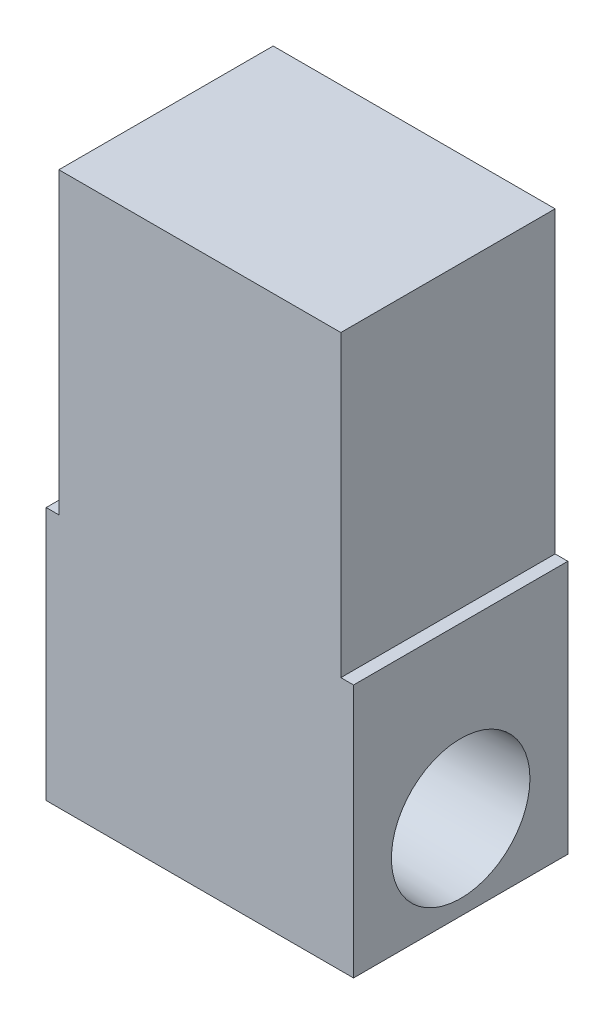
ISO-10303-21;
HEADER;
FILE_DESCRIPTION(('STEP AP214'),'2;1');
FILE_NAME('part.step','',(''),(''),'','','');
FILE_SCHEMA(('AUTOMOTIVE_DESIGN { 1 0 10303 214 1 1 1 1 }'));
ENDSEC;
DATA;
#1=APPLICATION_CONTEXT('core data for automotive mechanical design processes');
#2=APPLICATION_PROTOCOL_DEFINITION('international standard','automotive_design',2000,#1);
#3=PRODUCT_CONTEXT('',#1,'mechanical');
#4=PRODUCT('Part','Part','',(#3));
#5=PRODUCT_RELATED_PRODUCT_CATEGORY('part','',(#4));
#6=PRODUCT_DEFINITION_FORMATION('','',#4);
#7=PRODUCT_DEFINITION_CONTEXT('part definition',#1,'design');
#8=PRODUCT_DEFINITION('design','',#6,#7);
#9=PRODUCT_DEFINITION_SHAPE('','',#8);
#10=(LENGTH_UNIT() NAMED_UNIT(*) SI_UNIT(.MILLI.,.METRE.));
#11=(NAMED_UNIT(*) PLANE_ANGLE_UNIT() SI_UNIT($,.RADIAN.));
#12=(NAMED_UNIT(*) SI_UNIT($,.STERADIAN.) SOLID_ANGLE_UNIT());
#13=UNCERTAINTY_MEASURE_WITH_UNIT(LENGTH_MEASURE(1.E-05),#10,'distance_accuracy_value','');
#14=(GEOMETRIC_REPRESENTATION_CONTEXT(3) GLOBAL_UNCERTAINTY_ASSIGNED_CONTEXT((#13)) GLOBAL_UNIT_ASSIGNED_CONTEXT((#10,
#11,#12)) REPRESENTATION_CONTEXT('',''));
#15=CARTESIAN_POINT('',(0.,0.,0.));
#16=DIRECTION('',(0.,0.,1.));
#17=DIRECTION('',(1.,0.,0.));
#18=AXIS2_PLACEMENT_3D('',#15,#16,#17);
#19=CARTESIAN_POINT('',(0.,-11.43,19.304));
#20=DIRECTION('',(0.,1.,0.));
#21=DIRECTION('',(0.,0.,1.));
#22=AXIS2_PLACEMENT_3D('',#19,#20,#21);
#23=PLANE('',#22);
#24=DIRECTION('',(1.,0.,0.));
#25=VECTOR('',#24,1.);
#26=CARTESIAN_POINT('',(0.,-11.43,0.));
#27=LINE('',#26,#25);
#28=CARTESIAN_POINT('',(-13.843,-11.43,0.));
#29=VERTEX_POINT('',#28);
#30=CARTESIAN_POINT('',(13.843,-11.43,0.));
#31=VERTEX_POINT('',#30);
#32=EDGE_CURVE('E164',#29,#31,#27,.T.);
#33=ORIENTED_EDGE('',*,*,#32,.T.);
#34=DIRECTION('',(0.,0.,-1.));
#35=VECTOR('',#34,1.);
#36=CARTESIAN_POINT('',(13.843,-11.43,19.304));
#37=LINE('',#36,#35);
#38=CARTESIAN_POINT('',(13.843,-11.43,19.304));
#39=VERTEX_POINT('',#38);
#40=EDGE_CURVE('E11',#39,#31,#37,.T.);
#41=ORIENTED_EDGE('',*,*,#40,.F.);
#42=DIRECTION('',(1.,0.,0.));
#43=VECTOR('',#42,1.);
#44=CARTESIAN_POINT('',(0.,-11.43,19.304));
#45=LINE('',#44,#43);
#46=CARTESIAN_POINT('',(-13.843,-11.43,19.304));
#47=VERTEX_POINT('',#46);
#48=EDGE_CURVE('E155',#47,#39,#45,.T.);
#49=ORIENTED_EDGE('',*,*,#48,.F.);
#50=DIRECTION('',(0.,0.,-1.));
#51=VECTOR('',#50,1.);
#52=CARTESIAN_POINT('',(-13.843,-11.43,19.304));
#53=LINE('',#52,#51);
#54=EDGE_CURVE('E60',#47,#29,#53,.T.);
#55=ORIENTED_EDGE('',*,*,#54,.T.);
#56=EDGE_LOOP('',(#33,#41,#49,#55));
#57=FACE_BOUND('',#56,.T.);
#58=ADVANCED_FACE('F43',(#57),#23,.F.);
#59=CARTESIAN_POINT('',(13.843,0.,19.304));
#60=DIRECTION('',(-1.,0.,0.));
#61=DIRECTION('',(0.,0.,1.));
#62=AXIS2_PLACEMENT_3D('',#59,#60,#61);
#63=PLANE('',#62);
#64=CARTESIAN_POINT('',(13.843,-3.81,9.652));
#65=DIRECTION('',(1.,0.,0.));
#66=DIRECTION('',(0.,0.,-1.));
#67=AXIS2_PLACEMENT_3D('',#64,#65,#66);
#68=CIRCLE('',#67,6.2402847);
#69=CARTESIAN_POINT('',(13.843,-3.81,3.4117153));
#70=VERTEX_POINT('',#69);
#71=EDGE_CURVE('E173',#70,#70,#68,.T.);
#72=ORIENTED_EDGE('',*,*,#71,.F.);
#73=EDGE_LOOP('',(#72));
#74=FACE_BOUND('',#73,.T.);
#75=DIRECTION('',(0.,1.,0.));
#76=VECTOR('',#75,1.);
#77=CARTESIAN_POINT('',(13.843,0.,0.));
#78=LINE('',#77,#76);
#79=CARTESIAN_POINT('',(13.843,11.43,0.));
#80=VERTEX_POINT('',#79);
#81=EDGE_CURVE('E226',#31,#80,#78,.T.);
#82=ORIENTED_EDGE('',*,*,#81,.T.);
#83=DIRECTION('',(0.,0.,-1.));
#84=VECTOR('',#83,1.);
#85=CARTESIAN_POINT('',(13.843,11.43,19.304));
#86=LINE('',#85,#84);
#87=CARTESIAN_POINT('',(13.843,11.43,19.304));
#88=VERTEX_POINT('',#87);
#89=EDGE_CURVE('E52',#88,#80,#86,.T.);
#90=ORIENTED_EDGE('',*,*,#89,.F.);
#91=DIRECTION('',(0.,1.,0.));
#92=VECTOR('',#91,1.);
#93=CARTESIAN_POINT('',(13.843,0.,19.304));
#94=LINE('',#93,#92);
#95=EDGE_CURVE('E99',#39,#88,#94,.T.);
#96=ORIENTED_EDGE('',*,*,#95,.F.);
#97=ORIENTED_EDGE('',*,*,#40,.T.);
#98=EDGE_LOOP('',(#82,#90,#96,#97));
#99=FACE_BOUND('',#98,.T.);
#100=ADVANCED_FACE('F227',(#74,#99),#63,.F.);
#101=CARTESIAN_POINT('',(0.,11.43,19.304));
#102=DIRECTION('',(0.,1.,0.));
#103=DIRECTION('',(0.,0.,1.));
#104=AXIS2_PLACEMENT_3D('',#101,#102,#103);
#105=PLANE('',#104);
#106=DIRECTION('',(1.,0.,0.));
#107=VECTOR('',#106,1.);
#108=CARTESIAN_POINT('',(0.,11.43,0.));
#109=LINE('',#108,#107);
#110=CARTESIAN_POINT('',(12.7,11.43,0.));
#111=VERTEX_POINT('',#110);
#112=EDGE_CURVE('E206',#111,#80,#109,.T.);
#113=ORIENTED_EDGE('',*,*,#112,.F.);
#114=DIRECTION('',(0.,0.,-1.));
#115=VECTOR('',#114,1.);
#116=CARTESIAN_POINT('',(12.7,11.43,19.304));
#117=LINE('',#116,#115);
#118=CARTESIAN_POINT('',(12.7,11.43,19.304));
#119=VERTEX_POINT('',#118);
#120=EDGE_CURVE('E219',#119,#111,#117,.T.);
#121=ORIENTED_EDGE('',*,*,#120,.F.);
#122=DIRECTION('',(1.,0.,0.));
#123=VECTOR('',#122,1.);
#124=CARTESIAN_POINT('',(0.,11.43,19.304));
#125=LINE('',#124,#123);
#126=EDGE_CURVE('E143',#119,#88,#125,.T.);
#127=ORIENTED_EDGE('',*,*,#126,.T.);
#128=ORIENTED_EDGE('',*,*,#89,.T.);
#129=EDGE_LOOP('',(#113,#121,#127,#128));
#130=FACE_BOUND('',#129,.T.);
#131=ADVANCED_FACE('F224',(#130),#105,.T.);
#132=CARTESIAN_POINT('',(12.7,0.,19.304));
#133=DIRECTION('',(-1.,0.,0.));
#134=DIRECTION('',(0.,0.,1.));
#135=AXIS2_PLACEMENT_3D('',#132,#133,#134);
#136=PLANE('',#135);
#137=DIRECTION('',(0.,1.,0.));
#138=VECTOR('',#137,1.);
#139=CARTESIAN_POINT('',(12.7,0.,0.));
#140=LINE('',#139,#138);
#141=CARTESIAN_POINT('',(12.7,38.354,0.));
#142=VERTEX_POINT('',#141);
#143=EDGE_CURVE('E235',#111,#142,#140,.T.);
#144=ORIENTED_EDGE('',*,*,#143,.T.);
#145=DIRECTION('',(0.,0.,-1.));
#146=VECTOR('',#145,1.);
#147=CARTESIAN_POINT('',(12.7,38.354,19.304));
#148=LINE('',#147,#146);
#149=CARTESIAN_POINT('',(12.7,38.354,19.304));
#150=VERTEX_POINT('',#149);
#151=EDGE_CURVE('E216',#150,#142,#148,.T.);
#152=ORIENTED_EDGE('',*,*,#151,.F.);
#153=DIRECTION('',(0.,1.,0.));
#154=VECTOR('',#153,1.);
#155=CARTESIAN_POINT('',(12.7,0.,19.304));
#156=LINE('',#155,#154);
#157=EDGE_CURVE('E150',#119,#150,#156,.T.);
#158=ORIENTED_EDGE('',*,*,#157,.F.);
#159=ORIENTED_EDGE('',*,*,#120,.T.);
#160=EDGE_LOOP('',(#144,#152,#158,#159));
#161=FACE_BOUND('',#160,.T.);
#162=ADVANCED_FACE('F249',(#161),#136,.F.);
#163=CARTESIAN_POINT('',(0.,38.354,19.304));
#164=DIRECTION('',(0.,1.,0.));
#165=DIRECTION('',(0.,0.,1.));
#166=AXIS2_PLACEMENT_3D('',#163,#164,#165);
#167=PLANE('',#166);
#168=DIRECTION('',(1.,0.,0.));
#169=VECTOR('',#168,1.);
#170=CARTESIAN_POINT('',(0.,38.354,0.));
#171=LINE('',#170,#169);
#172=CARTESIAN_POINT('',(-12.7,38.354,0.));
#173=VERTEX_POINT('',#172);
#174=EDGE_CURVE('E238',#173,#142,#171,.T.);
#175=ORIENTED_EDGE('',*,*,#174,.F.);
#176=DIRECTION('',(0.,0.,-1.));
#177=VECTOR('',#176,1.);
#178=CARTESIAN_POINT('',(-12.7,38.354,19.304));
#179=LINE('',#178,#177);
#180=CARTESIAN_POINT('',(-12.7,38.354,19.304));
#181=VERTEX_POINT('',#180);
#182=EDGE_CURVE('E127',#181,#173,#179,.T.);
#183=ORIENTED_EDGE('',*,*,#182,.F.);
#184=DIRECTION('',(1.,0.,0.));
#185=VECTOR('',#184,1.);
#186=CARTESIAN_POINT('',(0.,38.354,19.304));
#187=LINE('',#186,#185);
#188=EDGE_CURVE('E136',#181,#150,#187,.T.);
#189=ORIENTED_EDGE('',*,*,#188,.T.);
#190=ORIENTED_EDGE('',*,*,#151,.T.);
#191=EDGE_LOOP('',(#175,#183,#189,#190));
#192=FACE_BOUND('',#191,.T.);
#193=ADVANCED_FACE('F245',(#192),#167,.T.);
#194=CARTESIAN_POINT('',(-12.7,0.,19.304));
#195=DIRECTION('',(-1.,0.,0.));
#196=DIRECTION('',(0.,0.,1.));
#197=AXIS2_PLACEMENT_3D('',#194,#195,#196);
#198=PLANE('',#197);
#199=DIRECTION('',(0.,1.,0.));
#200=VECTOR('',#199,1.);
#201=CARTESIAN_POINT('',(-12.7,0.,0.));
#202=LINE('',#201,#200);
#203=CARTESIAN_POINT('',(-12.7,11.43,0.));
#204=VERTEX_POINT('',#203);
#205=EDGE_CURVE('E122',#204,#173,#202,.T.);
#206=ORIENTED_EDGE('',*,*,#205,.F.);
#207=DIRECTION('',(0.,0.,-1.));
#208=VECTOR('',#207,1.);
#209=CARTESIAN_POINT('',(-12.7,11.43,19.304));
#210=LINE('',#209,#208);
#211=CARTESIAN_POINT('',(-12.7,11.43,19.304));
#212=VERTEX_POINT('',#211);
#213=EDGE_CURVE('E117',#212,#204,#210,.T.);
#214=ORIENTED_EDGE('',*,*,#213,.F.);
#215=DIRECTION('',(0.,1.,0.));
#216=VECTOR('',#215,1.);
#217=CARTESIAN_POINT('',(-12.7,0.,19.304));
#218=LINE('',#217,#216);
#219=EDGE_CURVE('E120',#212,#181,#218,.T.);
#220=ORIENTED_EDGE('',*,*,#219,.T.);
#221=ORIENTED_EDGE('',*,*,#182,.T.);
#222=EDGE_LOOP('',(#206,#214,#220,#221));
#223=FACE_BOUND('',#222,.T.);
#224=ADVANCED_FACE('F119',(#223),#198,.T.);
#225=CARTESIAN_POINT('',(-13.843,11.43,0.));
#226=VERTEX_POINT('',#225);
#227=EDGE_CURVE('E202',#226,#204,#109,.T.);
#228=ORIENTED_EDGE('',*,*,#227,.F.);
#229=DIRECTION('',(0.,0.,-1.));
#230=VECTOR('',#229,1.);
#231=CARTESIAN_POINT('',(-13.843,11.43,19.304));
#232=LINE('',#231,#230);
#233=CARTESIAN_POINT('',(-13.843,11.43,19.304));
#234=VERTEX_POINT('',#233);
#235=EDGE_CURVE('E87',#234,#226,#232,.T.);
#236=ORIENTED_EDGE('',*,*,#235,.F.);
#237=EDGE_CURVE('E134',#234,#212,#125,.T.);
#238=ORIENTED_EDGE('',*,*,#237,.T.);
#239=ORIENTED_EDGE('',*,*,#213,.T.);
#240=EDGE_LOOP('',(#228,#236,#238,#239));
#241=FACE_BOUND('',#240,.T.);
#242=ADVANCED_FACE('F139',(#241),#105,.T.);
#243=CARTESIAN_POINT('',(-13.843,0.,19.304));
#244=DIRECTION('',(-1.,0.,0.));
#245=DIRECTION('',(0.,0.,1.));
#246=AXIS2_PLACEMENT_3D('',#243,#244,#245);
#247=PLANE('',#246);
#248=CARTESIAN_POINT('',(-13.843,-3.81,9.652));
#249=DIRECTION('',(-1.,0.,0.));
#250=DIRECTION('',(0.,0.,1.));
#251=AXIS2_PLACEMENT_3D('',#248,#249,#250);
#252=CIRCLE('',#251,6.2402847);
#253=CARTESIAN_POINT('',(-13.843,-3.81,15.8922847));
#254=VERTEX_POINT('',#253);
#255=EDGE_CURVE('E189',#254,#254,#252,.T.);
#256=ORIENTED_EDGE('',*,*,#255,.F.);
#257=EDGE_LOOP('',(#256));
#258=FACE_BOUND('',#257,.T.);
#259=DIRECTION('',(0.,1.,0.));
#260=VECTOR('',#259,1.);
#261=CARTESIAN_POINT('',(-13.843,0.,0.));
#262=LINE('',#261,#260);
#263=EDGE_CURVE('E157',#29,#226,#262,.T.);
#264=ORIENTED_EDGE('',*,*,#263,.F.);
#265=ORIENTED_EDGE('',*,*,#54,.F.);
#266=DIRECTION('',(0.,1.,0.));
#267=VECTOR('',#266,1.);
#268=CARTESIAN_POINT('',(-13.843,0.,19.304));
#269=LINE('',#268,#267);
#270=EDGE_CURVE('E141',#47,#234,#269,.T.);
#271=ORIENTED_EDGE('',*,*,#270,.T.);
#272=ORIENTED_EDGE('',*,*,#235,.T.);
#273=EDGE_LOOP('',(#264,#265,#271,#272));
#274=FACE_BOUND('',#273,.T.);
#275=ADVANCED_FACE('F196',(#258,#274),#247,.T.);
#276=CARTESIAN_POINT('',(0.,0.,19.304));
#277=DIRECTION('',(0.,0.,1.));
#278=DIRECTION('',(1.,0.,0.));
#279=AXIS2_PLACEMENT_3D('',#276,#277,#278);
#280=PLANE('',#279);
#281=ORIENTED_EDGE('',*,*,#48,.T.);
#282=ORIENTED_EDGE('',*,*,#95,.T.);
#283=ORIENTED_EDGE('',*,*,#126,.F.);
#284=ORIENTED_EDGE('',*,*,#157,.T.);
#285=ORIENTED_EDGE('',*,*,#188,.F.);
#286=ORIENTED_EDGE('',*,*,#219,.F.);
#287=ORIENTED_EDGE('',*,*,#237,.F.);
#288=ORIENTED_EDGE('',*,*,#270,.F.);
#289=EDGE_LOOP('',(#281,#282,#283,#284,#285,#286,#287,#288));
#290=FACE_BOUND('',#289,.T.);
#291=ADVANCED_FACE('F132',(#290),#280,.T.);
#292=CARTESIAN_POINT('',(0.,0.,0.));
#293=DIRECTION('',(0.,0.,1.));
#294=DIRECTION('',(1.,0.,0.));
#295=AXIS2_PLACEMENT_3D('',#292,#293,#294);
#296=PLANE('',#295);
#297=ORIENTED_EDGE('',*,*,#32,.F.);
#298=ORIENTED_EDGE('',*,*,#263,.T.);
#299=ORIENTED_EDGE('',*,*,#227,.T.);
#300=ORIENTED_EDGE('',*,*,#205,.T.);
#301=ORIENTED_EDGE('',*,*,#174,.T.);
#302=ORIENTED_EDGE('',*,*,#143,.F.);
#303=ORIENTED_EDGE('',*,*,#112,.T.);
#304=ORIENTED_EDGE('',*,*,#81,.F.);
#305=EDGE_LOOP('',(#297,#298,#299,#300,#301,#302,#303,#304));
#306=FACE_BOUND('',#305,.T.);
#307=ADVANCED_FACE('F232',(#306),#296,.F.);
#308=CARTESIAN_POINT('',(3.68300000000001,-3.81,9.652));
#309=DIRECTION('',(1.,0.,0.));
#310=DIRECTION('',(0.,0.,-1.));
#311=AXIS2_PLACEMENT_3D('',#308,#309,#310);
#312=CONICAL_SURFACE('',#311,5.5626,1.02974425867665);
#313=CARTESIAN_POINT('',(0.340652720597297,-3.81,9.652));
#314=VERTEX_POINT('',#313);
#315=VERTEX_LOOP('',#314);
#316=FACE_BOUND('',#315,.T.);
#317=CARTESIAN_POINT('',(3.68300000000001,-3.81,9.652));
#318=DIRECTION('',(1.,0.,0.));
#319=DIRECTION('',(0.,0.,-1.));
#320=AXIS2_PLACEMENT_3D('',#317,#318,#319);
#321=CIRCLE('',#320,5.5626);
#322=CARTESIAN_POINT('',(3.68300000000001,-3.81,4.0894));
#323=VERTEX_POINT('',#322);
#324=EDGE_CURVE('E160',#323,#323,#321,.T.);
#325=ORIENTED_EDGE('',*,*,#324,.T.);
#326=EDGE_LOOP('',(#325));
#327=FACE_BOUND('',#326,.T.);
#328=ADVANCED_FACE('F291',(#316,#327),#312,.F.);
#329=CARTESIAN_POINT('',(13.843,-3.81,9.652));
#330=DIRECTION('',(1.,0.,0.));
#331=DIRECTION('',(0.,0.,-1.));
#332=AXIS2_PLACEMENT_3D('',#329,#330,#331);
#333=CYLINDRICAL_SURFACE('',#332,5.5626);
#334=ORIENTED_EDGE('',*,*,#324,.F.);
#335=EDGE_LOOP('',(#334));
#336=FACE_BOUND('',#335,.T.);
#337=CARTESIAN_POINT('',(3.937,-3.81,9.652));
#338=DIRECTION('',(1.,0.,0.));
#339=DIRECTION('',(0.,0.,-1.));
#340=AXIS2_PLACEMENT_3D('',#337,#338,#339);
#341=CIRCLE('',#340,5.5626);
#342=CARTESIAN_POINT('',(3.937,-3.81,4.0894));
#343=VERTEX_POINT('',#342);
#344=EDGE_CURVE('E165',#343,#343,#341,.T.);
#345=ORIENTED_EDGE('',*,*,#344,.T.);
#346=EDGE_LOOP('',(#345));
#347=FACE_BOUND('',#346,.T.);
#348=ADVANCED_FACE('F283',(#336,#347),#333,.F.);
#349=CARTESIAN_POINT('',(3.937,1.7526,9.652));
#350=DIRECTION('',(-1.,0.,0.));
#351=DIRECTION('',(0.,0.,1.));
#352=AXIS2_PLACEMENT_3D('',#349,#350,#351);
#353=PLANE('',#352);
#354=ORIENTED_EDGE('',*,*,#344,.F.);
#355=EDGE_LOOP('',(#354));
#356=FACE_BOUND('',#355,.T.);
#357=CARTESIAN_POINT('',(3.937,-3.81,9.652));
#358=DIRECTION('',(1.,0.,0.));
#359=DIRECTION('',(0.,0.,-1.));
#360=AXIS2_PLACEMENT_3D('',#357,#358,#359);
#361=CIRCLE('',#360,5.94368579417671);
#362=CARTESIAN_POINT('',(3.937,-3.81,3.70831420582328));
#363=VERTEX_POINT('',#362);
#364=EDGE_CURVE('E169',#363,#363,#361,.T.);
#365=ORIENTED_EDGE('',*,*,#364,.T.);
#366=EDGE_LOOP('',(#365));
#367=FACE_BOUND('',#366,.T.);
#368=ADVANCED_FACE('F273',(#356,#367),#353,.F.);
#369=CARTESIAN_POINT('',(13.843,-3.81,9.652));
#370=DIRECTION('',(1.,0.,0.));
#371=DIRECTION('',(0.,0.,-1.));
#372=AXIS2_PLACEMENT_3D('',#369,#370,#371);
#373=CONICAL_SURFACE('',#372,6.2402847,0.0299323966717032);
#374=ORIENTED_EDGE('',*,*,#364,.F.);
#375=EDGE_LOOP('',(#374));
#376=FACE_BOUND('',#375,.T.);
#377=ORIENTED_EDGE('',*,*,#71,.T.);
#378=EDGE_LOOP('',(#377));
#379=FACE_BOUND('',#378,.T.);
#380=ADVANCED_FACE('F270',(#376,#379),#373,.F.);
#381=CARTESIAN_POINT('',(-3.683,-3.81,9.652));
#382=DIRECTION('',(-1.,0.,0.));
#383=DIRECTION('',(0.,0.,1.));
#384=AXIS2_PLACEMENT_3D('',#381,#382,#383);
#385=CONICAL_SURFACE('',#384,5.56260000000001,1.02974425867665);
#386=CARTESIAN_POINT('',(-0.340652720597277,-3.81,9.652));
#387=VERTEX_POINT('',#386);
#388=VERTEX_LOOP('',#387);
#389=FACE_BOUND('',#388,.T.);
#390=CARTESIAN_POINT('',(-3.683,-3.81,9.652));
#391=DIRECTION('',(-1.,0.,0.));
#392=DIRECTION('',(0.,0.,1.));
#393=AXIS2_PLACEMENT_3D('',#390,#391,#392);
#394=CIRCLE('',#393,5.56260000000001);
#395=CARTESIAN_POINT('',(-3.683,-3.81,15.2146));
#396=VERTEX_POINT('',#395);
#397=EDGE_CURVE('E177',#396,#396,#394,.T.);
#398=ORIENTED_EDGE('',*,*,#397,.T.);
#399=EDGE_LOOP('',(#398));
#400=FACE_BOUND('',#399,.T.);
#401=ADVANCED_FACE('F272',(#389,#400),#385,.F.);
#402=CARTESIAN_POINT('',(-13.843,-3.81,9.652));
#403=DIRECTION('',(-1.,0.,0.));
#404=DIRECTION('',(0.,0.,1.));
#405=AXIS2_PLACEMENT_3D('',#402,#403,#404);
#406=CYLINDRICAL_SURFACE('',#405,5.56260000000001);
#407=ORIENTED_EDGE('',*,*,#397,.F.);
#408=EDGE_LOOP('',(#407));
#409=FACE_BOUND('',#408,.T.);
#410=CARTESIAN_POINT('',(-3.937,-3.81,9.652));
#411=DIRECTION('',(-1.,0.,0.));
#412=DIRECTION('',(0.,0.,1.));
#413=AXIS2_PLACEMENT_3D('',#410,#411,#412);
#414=CIRCLE('',#413,5.56260000000001);
#415=CARTESIAN_POINT('',(-3.937,-3.81,15.2146));
#416=VERTEX_POINT('',#415);
#417=EDGE_CURVE('E181',#416,#416,#414,.T.);
#418=ORIENTED_EDGE('',*,*,#417,.T.);
#419=EDGE_LOOP('',(#418));
#420=FACE_BOUND('',#419,.T.);
#421=ADVANCED_FACE('F280',(#409,#420),#406,.F.);
#422=CARTESIAN_POINT('',(-3.937,1.75260000000001,9.652));
#423=DIRECTION('',(1.,0.,0.));
#424=DIRECTION('',(0.,0.,-1.));
#425=AXIS2_PLACEMENT_3D('',#422,#423,#424);
#426=PLANE('',#425);
#427=ORIENTED_EDGE('',*,*,#417,.F.);
#428=EDGE_LOOP('',(#427));
#429=FACE_BOUND('',#428,.T.);
#430=CARTESIAN_POINT('',(-3.937,-3.81,9.652));
#431=DIRECTION('',(-1.,0.,0.));
#432=DIRECTION('',(0.,0.,1.));
#433=AXIS2_PLACEMENT_3D('',#430,#431,#432);
#434=CIRCLE('',#433,5.94368579417672);
#435=CARTESIAN_POINT('',(-3.937,-3.81,15.5956857941767));
#436=VERTEX_POINT('',#435);
#437=EDGE_CURVE('E185',#436,#436,#434,.T.);
#438=ORIENTED_EDGE('',*,*,#437,.T.);
#439=EDGE_LOOP('',(#438));
#440=FACE_BOUND('',#439,.T.);
#441=ADVANCED_FACE('F364',(#429,#440),#426,.F.);
#442=CARTESIAN_POINT('',(-13.843,-3.81,9.652));
#443=DIRECTION('',(-1.,0.,0.));
#444=DIRECTION('',(0.,0.,1.));
#445=AXIS2_PLACEMENT_3D('',#442,#443,#444);
#446=CONICAL_SURFACE('',#445,6.2402847,0.0299323966717025);
#447=ORIENTED_EDGE('',*,*,#437,.F.);
#448=EDGE_LOOP('',(#447));
#449=FACE_BOUND('',#448,.T.);
#450=ORIENTED_EDGE('',*,*,#255,.T.);
#451=EDGE_LOOP('',(#450));
#452=FACE_BOUND('',#451,.T.);
#453=ADVANCED_FACE('F194',(#449,#452),#446,.F.);
#454=CLOSED_SHELL('',(#58,#100,#131,#162,#193,#224,#242,#275,#291,#307,#328,#348,#368,#380,#401,
#421,#441,#453));
#455=MANIFOLD_SOLID_BREP('B2',#454);
#456=ADVANCED_BREP_SHAPE_REPRESENTATION('',(#18,#455),#14);
#457=SHAPE_DEFINITION_REPRESENTATION(#9,#456);
ENDSEC;
END-ISO-10303-21;
